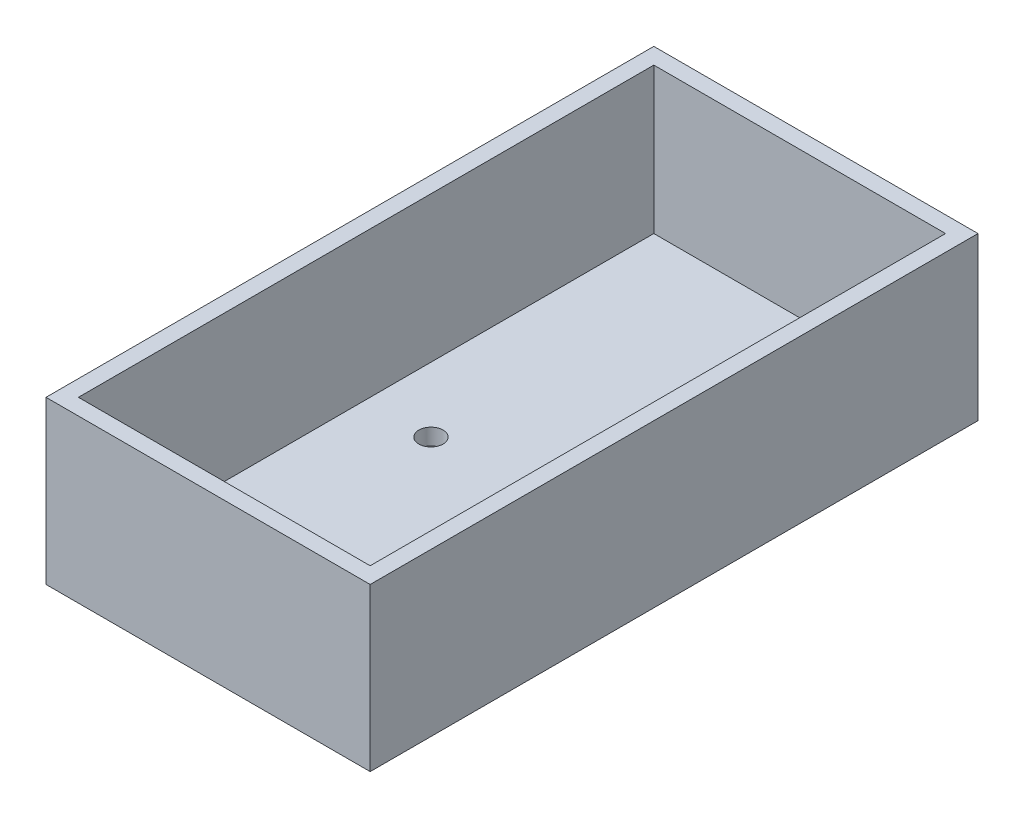
ISO-10303-21;
HEADER;
FILE_DESCRIPTION(('STEP AP214'),'2;1');
FILE_NAME('part.step','',(''),(''),'','','');
FILE_SCHEMA(('AUTOMOTIVE_DESIGN { 1 0 10303 214 1 1 1 1 }'));
ENDSEC;
DATA;
#1=APPLICATION_CONTEXT('core data for automotive mechanical design processes');
#2=APPLICATION_PROTOCOL_DEFINITION('international standard','automotive_design',2000,#1);
#3=PRODUCT_CONTEXT('',#1,'mechanical');
#4=PRODUCT('Part','Part','',(#3));
#5=PRODUCT_RELATED_PRODUCT_CATEGORY('part','',(#4));
#6=PRODUCT_DEFINITION_FORMATION('','',#4);
#7=PRODUCT_DEFINITION_CONTEXT('part definition',#1,'design');
#8=PRODUCT_DEFINITION('design','',#6,#7);
#9=PRODUCT_DEFINITION_SHAPE('','',#8);
#10=(LENGTH_UNIT() NAMED_UNIT(*) SI_UNIT(.MILLI.,.METRE.));
#11=(NAMED_UNIT(*) PLANE_ANGLE_UNIT() SI_UNIT($,.RADIAN.));
#12=(NAMED_UNIT(*) SI_UNIT($,.STERADIAN.) SOLID_ANGLE_UNIT());
#13=UNCERTAINTY_MEASURE_WITH_UNIT(LENGTH_MEASURE(1.E-05),#10,'distance_accuracy_value','');
#14=(GEOMETRIC_REPRESENTATION_CONTEXT(3) GLOBAL_UNCERTAINTY_ASSIGNED_CONTEXT((#13)) GLOBAL_UNIT_ASSIGNED_CONTEXT((#10,
#11,#12)) REPRESENTATION_CONTEXT('',''));
#15=CARTESIAN_POINT('',(0.,0.,0.));
#16=DIRECTION('',(0.,0.,1.));
#17=DIRECTION('',(1.,0.,0.));
#18=AXIS2_PLACEMENT_3D('',#15,#16,#17);
#19=CARTESIAN_POINT('',(20.,20.,37.5));
#20=DIRECTION('',(-1.,0.,0.));
#21=DIRECTION('',(0.,0.,1.));
#22=AXIS2_PLACEMENT_3D('',#19,#20,#21);
#23=PLANE('',#22);
#24=DIRECTION('',(0.,0.,-1.));
#25=VECTOR('',#24,1.);
#26=CARTESIAN_POINT('',(20.,0.,37.5));
#27=LINE('',#26,#25);
#28=CARTESIAN_POINT('',(20.,0.,37.5));
#29=VERTEX_POINT('',#28);
#30=CARTESIAN_POINT('',(20.,0.,-37.5));
#31=VERTEX_POINT('',#30);
#32=EDGE_CURVE('E146',#29,#31,#27,.T.);
#33=ORIENTED_EDGE('',*,*,#32,.T.);
#34=DIRECTION('',(0.,-1.,0.));
#35=VECTOR('',#34,1.);
#36=CARTESIAN_POINT('',(20.,20.,-37.5));
#37=LINE('',#36,#35);
#38=CARTESIAN_POINT('',(20.,20.,-37.5));
#39=VERTEX_POINT('',#38);
#40=EDGE_CURVE('E11',#39,#31,#37,.T.);
#41=ORIENTED_EDGE('',*,*,#40,.F.);
#42=DIRECTION('',(0.,0.,-1.));
#43=VECTOR('',#42,1.);
#44=CARTESIAN_POINT('',(20.,20.,37.5));
#45=LINE('',#44,#43);
#46=CARTESIAN_POINT('',(20.,20.,37.5));
#47=VERTEX_POINT('',#46);
#48=EDGE_CURVE('E150',#47,#39,#45,.T.);
#49=ORIENTED_EDGE('',*,*,#48,.F.);
#50=DIRECTION('',(0.,-1.,0.));
#51=VECTOR('',#50,1.);
#52=CARTESIAN_POINT('',(20.,20.,37.5));
#53=LINE('',#52,#51);
#54=EDGE_CURVE('E156',#47,#29,#53,.T.);
#55=ORIENTED_EDGE('',*,*,#54,.T.);
#56=EDGE_LOOP('',(#33,#41,#49,#55));
#57=FACE_BOUND('',#56,.T.);
#58=ADVANCED_FACE('F33',(#57),#23,.F.);
#59=CARTESIAN_POINT('',(20.,20.,-37.5));
#60=DIRECTION('',(0.,0.,1.));
#61=DIRECTION('',(1.,0.,0.));
#62=AXIS2_PLACEMENT_3D('',#59,#60,#61);
#63=PLANE('',#62);
#64=DIRECTION('',(-1.,0.,0.));
#65=VECTOR('',#64,1.);
#66=CARTESIAN_POINT('',(20.,0.,-37.5));
#67=LINE('',#66,#65);
#68=CARTESIAN_POINT('',(-20.,0.,-37.5));
#69=VERTEX_POINT('',#68);
#70=EDGE_CURVE('E159',#31,#69,#67,.T.);
#71=ORIENTED_EDGE('',*,*,#70,.T.);
#72=DIRECTION('',(0.,-1.,0.));
#73=VECTOR('',#72,1.);
#74=CARTESIAN_POINT('',(-20.,20.,-37.5));
#75=LINE('',#74,#73);
#76=CARTESIAN_POINT('',(-20.,20.,-37.5));
#77=VERTEX_POINT('',#76);
#78=EDGE_CURVE('E41',#77,#69,#75,.T.);
#79=ORIENTED_EDGE('',*,*,#78,.F.);
#80=DIRECTION('',(-1.,0.,0.));
#81=VECTOR('',#80,1.);
#82=CARTESIAN_POINT('',(20.,20.,-37.5));
#83=LINE('',#82,#81);
#84=EDGE_CURVE('E86',#39,#77,#83,.T.);
#85=ORIENTED_EDGE('',*,*,#84,.F.);
#86=ORIENTED_EDGE('',*,*,#40,.T.);
#87=EDGE_LOOP('',(#71,#79,#85,#86));
#88=FACE_BOUND('',#87,.T.);
#89=ADVANCED_FACE('F193',(#88),#63,.F.);
#90=CARTESIAN_POINT('',(-20.,20.,37.5));
#91=DIRECTION('',(1.,0.,0.));
#92=DIRECTION('',(0.,0.,-1.));
#93=AXIS2_PLACEMENT_3D('',#90,#91,#92);
#94=PLANE('',#93);
#95=DIRECTION('',(0.,0.,1.));
#96=VECTOR('',#95,1.);
#97=CARTESIAN_POINT('',(-20.,0.,37.5));
#98=LINE('',#97,#96);
#99=CARTESIAN_POINT('',(-20.,0.,37.5));
#100=VERTEX_POINT('',#99);
#101=EDGE_CURVE('E161',#69,#100,#98,.T.);
#102=ORIENTED_EDGE('',*,*,#101,.T.);
#103=DIRECTION('',(0.,-1.,0.));
#104=VECTOR('',#103,1.);
#105=CARTESIAN_POINT('',(-20.,20.,37.5));
#106=LINE('',#105,#104);
#107=CARTESIAN_POINT('',(-20.,20.,37.5));
#108=VERTEX_POINT('',#107);
#109=EDGE_CURVE('E165',#108,#100,#106,.T.);
#110=ORIENTED_EDGE('',*,*,#109,.F.);
#111=DIRECTION('',(0.,0.,1.));
#112=VECTOR('',#111,1.);
#113=CARTESIAN_POINT('',(-20.,20.,37.5));
#114=LINE('',#113,#112);
#115=EDGE_CURVE('E153',#77,#108,#114,.T.);
#116=ORIENTED_EDGE('',*,*,#115,.F.);
#117=ORIENTED_EDGE('',*,*,#78,.T.);
#118=EDGE_LOOP('',(#102,#110,#116,#117));
#119=FACE_BOUND('',#118,.T.);
#120=ADVANCED_FACE('F198',(#119),#94,.F.);
#121=CARTESIAN_POINT('',(20.,20.,37.5));
#122=DIRECTION('',(0.,0.,-1.));
#123=DIRECTION('',(-1.,0.,0.));
#124=AXIS2_PLACEMENT_3D('',#121,#122,#123);
#125=PLANE('',#124);
#126=DIRECTION('',(1.,0.,0.));
#127=VECTOR('',#126,1.);
#128=CARTESIAN_POINT('',(20.,0.,37.5));
#129=LINE('',#128,#127);
#130=EDGE_CURVE('E79',#100,#29,#129,.T.);
#131=ORIENTED_EDGE('',*,*,#130,.T.);
#132=ORIENTED_EDGE('',*,*,#54,.F.);
#133=DIRECTION('',(1.,0.,0.));
#134=VECTOR('',#133,1.);
#135=CARTESIAN_POINT('',(20.,20.,37.5));
#136=LINE('',#135,#134);
#137=EDGE_CURVE('E58',#108,#47,#136,.T.);
#138=ORIENTED_EDGE('',*,*,#137,.F.);
#139=ORIENTED_EDGE('',*,*,#109,.T.);
#140=EDGE_LOOP('',(#131,#132,#138,#139));
#141=FACE_BOUND('',#140,.T.);
#142=ADVANCED_FACE('F209',(#141),#125,.F.);
#143=CARTESIAN_POINT('',(0.,20.,0.));
#144=DIRECTION('',(0.,1.,0.));
#145=DIRECTION('',(0.,0.,1.));
#146=AXIS2_PLACEMENT_3D('',#143,#144,#145);
#147=PLANE('',#146);
#148=DIRECTION('',(0.,0.,-1.));
#149=VECTOR('',#148,1.);
#150=CARTESIAN_POINT('',(18.,20.,-35.5));
#151=LINE('',#150,#149);
#152=CARTESIAN_POINT('',(18.,20.,35.5));
#153=VERTEX_POINT('',#152);
#154=CARTESIAN_POINT('',(18.,20.,-35.5));
#155=VERTEX_POINT('',#154);
#156=EDGE_CURVE('E49',#153,#155,#151,.T.);
#157=ORIENTED_EDGE('',*,*,#156,.F.);
#158=DIRECTION('',(1.,0.,0.));
#159=VECTOR('',#158,1.);
#160=CARTESIAN_POINT('',(-18.,20.,35.5));
#161=LINE('',#160,#159);
#162=CARTESIAN_POINT('',(-18.,20.,35.5));
#163=VERTEX_POINT('',#162);
#164=EDGE_CURVE('E128',#163,#153,#161,.T.);
#165=ORIENTED_EDGE('',*,*,#164,.F.);
#166=DIRECTION('',(0.,0.,1.));
#167=VECTOR('',#166,1.);
#168=CARTESIAN_POINT('',(-18.,20.,-35.5));
#169=LINE('',#168,#167);
#170=CARTESIAN_POINT('',(-18.,20.,-35.5));
#171=VERTEX_POINT('',#170);
#172=EDGE_CURVE('E131',#171,#163,#169,.T.);
#173=ORIENTED_EDGE('',*,*,#172,.F.);
#174=DIRECTION('',(-1.,0.,0.));
#175=VECTOR('',#174,1.);
#176=CARTESIAN_POINT('',(-18.,20.,-35.5));
#177=LINE('',#176,#175);
#178=EDGE_CURVE('E140',#155,#171,#177,.T.);
#179=ORIENTED_EDGE('',*,*,#178,.F.);
#180=EDGE_LOOP('',(#157,#165,#173,#179));
#181=FACE_BOUND('',#180,.T.);
#182=ORIENTED_EDGE('',*,*,#48,.T.);
#183=ORIENTED_EDGE('',*,*,#84,.T.);
#184=ORIENTED_EDGE('',*,*,#115,.T.);
#185=ORIENTED_EDGE('',*,*,#137,.T.);
#186=EDGE_LOOP('',(#182,#183,#184,#185));
#187=FACE_BOUND('',#186,.T.);
#188=ADVANCED_FACE('F207',(#181,#187),#147,.T.);
#189=CARTESIAN_POINT('',(0.,0.,0.));
#190=DIRECTION('',(0.,1.,0.));
#191=DIRECTION('',(0.,0.,1.));
#192=AXIS2_PLACEMENT_3D('',#189,#190,#191);
#193=PLANE('',#192);
#194=CARTESIAN_POINT('',(-10.,0.,0.));
#195=DIRECTION('',(0.,1.,0.));
#196=DIRECTION('',(0.,0.,1.));
#197=AXIS2_PLACEMENT_3D('',#194,#195,#196);
#198=CIRCLE('',#197,1.5);
#199=CARTESIAN_POINT('',(-10.,0.,1.5));
#200=VERTEX_POINT('',#199);
#201=EDGE_CURVE('E134',#200,#200,#198,.T.);
#202=ORIENTED_EDGE('',*,*,#201,.T.);
#203=EDGE_LOOP('',(#202));
#204=FACE_BOUND('',#203,.T.);
#205=CARTESIAN_POINT('',(10.,0.,0.));
#206=DIRECTION('',(0.,1.,0.));
#207=DIRECTION('',(0.,0.,1.));
#208=AXIS2_PLACEMENT_3D('',#205,#206,#207);
#209=CIRCLE('',#208,1.5);
#210=CARTESIAN_POINT('',(10.,0.,1.5));
#211=VERTEX_POINT('',#210);
#212=EDGE_CURVE('E170',#211,#211,#209,.T.);
#213=ORIENTED_EDGE('',*,*,#212,.T.);
#214=EDGE_LOOP('',(#213));
#215=FACE_BOUND('',#214,.T.);
#216=ORIENTED_EDGE('',*,*,#32,.F.);
#217=ORIENTED_EDGE('',*,*,#130,.F.);
#218=ORIENTED_EDGE('',*,*,#101,.F.);
#219=ORIENTED_EDGE('',*,*,#70,.F.);
#220=EDGE_LOOP('',(#216,#217,#218,#219));
#221=FACE_BOUND('',#220,.T.);
#222=ADVANCED_FACE('F182',(#204,#215,#221),#193,.F.);
#223=CARTESIAN_POINT('',(18.,2.,-35.5));
#224=DIRECTION('',(1.,0.,0.));
#225=DIRECTION('',(0.,0.,-1.));
#226=AXIS2_PLACEMENT_3D('',#223,#224,#225);
#227=PLANE('',#226);
#228=ORIENTED_EDGE('',*,*,#156,.T.);
#229=DIRECTION('',(0.,1.,0.));
#230=VECTOR('',#229,1.);
#231=CARTESIAN_POINT('',(18.,2.,-35.5));
#232=LINE('',#231,#230);
#233=CARTESIAN_POINT('',(18.,2.,-35.5));
#234=VERTEX_POINT('',#233);
#235=EDGE_CURVE('E106',#234,#155,#232,.T.);
#236=ORIENTED_EDGE('',*,*,#235,.F.);
#237=DIRECTION('',(0.,0.,-1.));
#238=VECTOR('',#237,1.);
#239=CARTESIAN_POINT('',(18.,2.,-35.5));
#240=LINE('',#239,#238);
#241=CARTESIAN_POINT('',(18.,2.,35.5));
#242=VERTEX_POINT('',#241);
#243=EDGE_CURVE('E110',#242,#234,#240,.T.);
#244=ORIENTED_EDGE('',*,*,#243,.F.);
#245=DIRECTION('',(0.,1.,0.));
#246=VECTOR('',#245,1.);
#247=CARTESIAN_POINT('',(18.,2.,35.5));
#248=LINE('',#247,#246);
#249=EDGE_CURVE('E144',#242,#153,#248,.T.);
#250=ORIENTED_EDGE('',*,*,#249,.T.);
#251=EDGE_LOOP('',(#228,#236,#244,#250));
#252=FACE_BOUND('',#251,.T.);
#253=ADVANCED_FACE('F108',(#252),#227,.F.);
#254=CARTESIAN_POINT('',(-18.,2.,35.5));
#255=DIRECTION('',(0.,0.,1.));
#256=DIRECTION('',(1.,0.,0.));
#257=AXIS2_PLACEMENT_3D('',#254,#255,#256);
#258=PLANE('',#257);
#259=ORIENTED_EDGE('',*,*,#164,.T.);
#260=ORIENTED_EDGE('',*,*,#249,.F.);
#261=DIRECTION('',(1.,0.,0.));
#262=VECTOR('',#261,1.);
#263=CARTESIAN_POINT('',(-18.,2.,35.5));
#264=LINE('',#263,#262);
#265=CARTESIAN_POINT('',(-18.,2.,35.5));
#266=VERTEX_POINT('',#265);
#267=EDGE_CURVE('E116',#266,#242,#264,.T.);
#268=ORIENTED_EDGE('',*,*,#267,.F.);
#269=DIRECTION('',(0.,1.,0.));
#270=VECTOR('',#269,1.);
#271=CARTESIAN_POINT('',(-18.,2.,35.5));
#272=LINE('',#271,#270);
#273=EDGE_CURVE('E147',#266,#163,#272,.T.);
#274=ORIENTED_EDGE('',*,*,#273,.T.);
#275=EDGE_LOOP('',(#259,#260,#268,#274));
#276=FACE_BOUND('',#275,.T.);
#277=ADVANCED_FACE('F244',(#276),#258,.F.);
#278=CARTESIAN_POINT('',(-18.,2.,-35.5));
#279=DIRECTION('',(-1.,0.,0.));
#280=DIRECTION('',(0.,0.,1.));
#281=AXIS2_PLACEMENT_3D('',#278,#279,#280);
#282=PLANE('',#281);
#283=ORIENTED_EDGE('',*,*,#172,.T.);
#284=ORIENTED_EDGE('',*,*,#273,.F.);
#285=DIRECTION('',(0.,0.,1.));
#286=VECTOR('',#285,1.);
#287=CARTESIAN_POINT('',(-18.,2.,-35.5));
#288=LINE('',#287,#286);
#289=CARTESIAN_POINT('',(-18.,2.,-35.5));
#290=VERTEX_POINT('',#289);
#291=EDGE_CURVE('E124',#290,#266,#288,.T.);
#292=ORIENTED_EDGE('',*,*,#291,.F.);
#293=DIRECTION('',(0.,1.,0.));
#294=VECTOR('',#293,1.);
#295=CARTESIAN_POINT('',(-18.,2.,-35.5));
#296=LINE('',#295,#294);
#297=EDGE_CURVE('E115',#290,#171,#296,.T.);
#298=ORIENTED_EDGE('',*,*,#297,.T.);
#299=EDGE_LOOP('',(#283,#284,#292,#298));
#300=FACE_BOUND('',#299,.T.);
#301=ADVANCED_FACE('F252',(#300),#282,.F.);
#302=CARTESIAN_POINT('',(-18.,2.,-35.5));
#303=DIRECTION('',(0.,0.,-1.));
#304=DIRECTION('',(-1.,0.,0.));
#305=AXIS2_PLACEMENT_3D('',#302,#303,#304);
#306=PLANE('',#305);
#307=ORIENTED_EDGE('',*,*,#178,.T.);
#308=ORIENTED_EDGE('',*,*,#297,.F.);
#309=DIRECTION('',(-1.,0.,0.));
#310=VECTOR('',#309,1.);
#311=CARTESIAN_POINT('',(-18.,2.,-35.5));
#312=LINE('',#311,#310);
#313=EDGE_CURVE('E119',#234,#290,#312,.T.);
#314=ORIENTED_EDGE('',*,*,#313,.F.);
#315=ORIENTED_EDGE('',*,*,#235,.T.);
#316=EDGE_LOOP('',(#307,#308,#314,#315));
#317=FACE_BOUND('',#316,.T.);
#318=ADVANCED_FACE('F120',(#317),#306,.F.);
#319=CARTESIAN_POINT('',(0.,2.,0.));
#320=DIRECTION('',(0.,1.,0.));
#321=DIRECTION('',(0.,0.,1.));
#322=AXIS2_PLACEMENT_3D('',#319,#320,#321);
#323=PLANE('',#322);
#324=CARTESIAN_POINT('',(-10.,2.,0.));
#325=DIRECTION('',(0.,1.,0.));
#326=DIRECTION('',(0.,0.,1.));
#327=AXIS2_PLACEMENT_3D('',#324,#325,#326);
#328=CIRCLE('',#327,1.5);
#329=CARTESIAN_POINT('',(-10.,2.,1.5));
#330=VERTEX_POINT('',#329);
#331=EDGE_CURVE('E36',#330,#330,#328,.T.);
#332=ORIENTED_EDGE('',*,*,#331,.F.);
#333=EDGE_LOOP('',(#332));
#334=FACE_BOUND('',#333,.T.);
#335=CARTESIAN_POINT('',(10.,2.,0.));
#336=DIRECTION('',(0.,1.,0.));
#337=DIRECTION('',(0.,0.,1.));
#338=AXIS2_PLACEMENT_3D('',#335,#336,#337);
#339=CIRCLE('',#338,1.5);
#340=CARTESIAN_POINT('',(10.,2.,1.5));
#341=VERTEX_POINT('',#340);
#342=EDGE_CURVE('E168',#341,#341,#339,.T.);
#343=ORIENTED_EDGE('',*,*,#342,.F.);
#344=EDGE_LOOP('',(#343));
#345=FACE_BOUND('',#344,.T.);
#346=ORIENTED_EDGE('',*,*,#243,.T.);
#347=ORIENTED_EDGE('',*,*,#313,.T.);
#348=ORIENTED_EDGE('',*,*,#291,.T.);
#349=ORIENTED_EDGE('',*,*,#267,.T.);
#350=EDGE_LOOP('',(#346,#347,#348,#349));
#351=FACE_BOUND('',#350,.T.);
#352=ADVANCED_FACE('F126',(#334,#345,#351),#323,.T.);
#353=CARTESIAN_POINT('',(10.,-1.2E-05,0.));
#354=DIRECTION('',(0.,1.,0.));
#355=DIRECTION('',(0.,0.,1.));
#356=AXIS2_PLACEMENT_3D('',#353,#354,#355);
#357=CYLINDRICAL_SURFACE('',#356,1.5);
#358=CARTESIAN_POINT('',(10.,2.,1.5));
#359=CARTESIAN_POINT('',(10.,1.97916666666667,1.5));
#360=CARTESIAN_POINT('',(10.,1.95833333333334,1.5));
#361=CARTESIAN_POINT('',(10.,1.91666666666667,1.5));
#362=CARTESIAN_POINT('',(10.,1.89583333333334,1.5));
#363=CARTESIAN_POINT('',(10.,1.85416666666667,1.5));
#364=CARTESIAN_POINT('',(10.,1.83333333333334,1.5));
#365=CARTESIAN_POINT('',(10.,1.79166666666667,1.5));
#366=CARTESIAN_POINT('',(10.,1.77083333333334,1.5));
#367=CARTESIAN_POINT('',(10.,1.72916666666667,1.5));
#368=CARTESIAN_POINT('',(10.,1.70833333333334,1.5));
#369=CARTESIAN_POINT('',(10.,1.66666666666667,1.5));
#370=CARTESIAN_POINT('',(10.,1.64583333333334,1.5));
#371=CARTESIAN_POINT('',(10.,1.60416666666667,1.5));
#372=CARTESIAN_POINT('',(10.,1.58333333333334,1.5));
#373=CARTESIAN_POINT('',(10.,1.54166666666667,1.5));
#374=CARTESIAN_POINT('',(10.,1.52083333333334,1.5));
#375=CARTESIAN_POINT('',(10.,1.47916666666667,1.5));
#376=CARTESIAN_POINT('',(10.,1.45833333333334,1.5));
#377=CARTESIAN_POINT('',(10.,1.41666666666667,1.5));
#378=CARTESIAN_POINT('',(10.,1.39583333333334,1.5));
#379=CARTESIAN_POINT('',(10.,1.35416666666667,1.5));
#380=CARTESIAN_POINT('',(10.,1.33333333333334,1.5));
#381=CARTESIAN_POINT('',(10.,1.29166666666667,1.5));
#382=CARTESIAN_POINT('',(10.,1.27083333333333,1.5));
#383=CARTESIAN_POINT('',(10.,1.22916666666667,1.5));
#384=CARTESIAN_POINT('',(10.,1.20833333333333,1.5));
#385=CARTESIAN_POINT('',(10.,1.16666666666667,1.5));
#386=CARTESIAN_POINT('',(10.,1.14583333333333,1.5));
#387=CARTESIAN_POINT('',(10.,1.10416666666667,1.5));
#388=CARTESIAN_POINT('',(10.,1.08333333333333,1.5));
#389=CARTESIAN_POINT('',(10.,1.04166666666667,1.5));
#390=CARTESIAN_POINT('',(10.,1.02083333333333,1.5));
#391=CARTESIAN_POINT('',(10.,0.979166666666668,1.5));
#392=CARTESIAN_POINT('',(10.,0.958333333333334,1.5));
#393=CARTESIAN_POINT('',(10.,0.916666666666668,1.5));
#394=CARTESIAN_POINT('',(10.,0.895833333333334,1.5));
#395=CARTESIAN_POINT('',(10.,0.854166666666668,1.5));
#396=CARTESIAN_POINT('',(10.,0.833333333333334,1.5));
#397=CARTESIAN_POINT('',(10.,0.791666666666668,1.5));
#398=CARTESIAN_POINT('',(10.,0.770833333333334,1.5));
#399=CARTESIAN_POINT('',(10.,0.729166666666668,1.5));
#400=CARTESIAN_POINT('',(10.,0.708333333333334,1.5));
#401=CARTESIAN_POINT('',(10.,0.666666666666668,1.5));
#402=CARTESIAN_POINT('',(10.,0.645833333333334,1.5));
#403=CARTESIAN_POINT('',(10.,0.604166666666668,1.5));
#404=CARTESIAN_POINT('',(10.,0.583333333333334,1.5));
#405=CARTESIAN_POINT('',(10.,0.541666666666667,1.5));
#406=CARTESIAN_POINT('',(10.,0.520833333333334,1.5));
#407=CARTESIAN_POINT('',(10.,0.479166666666667,1.5));
#408=CARTESIAN_POINT('',(10.,0.458333333333334,1.5));
#409=CARTESIAN_POINT('',(10.,0.416666666666667,1.5));
#410=CARTESIAN_POINT('',(10.,0.395833333333334,1.5));
#411=CARTESIAN_POINT('',(10.,0.354166666666667,1.5));
#412=CARTESIAN_POINT('',(10.,0.333333333333334,1.5));
#413=CARTESIAN_POINT('',(10.,0.291666666666667,1.5));
#414=CARTESIAN_POINT('',(10.,0.270833333333334,1.5));
#415=CARTESIAN_POINT('',(10.,0.229166666666667,1.5));
#416=CARTESIAN_POINT('',(10.,0.208333333333334,1.5));
#417=CARTESIAN_POINT('',(10.,0.166666666666667,1.5));
#418=CARTESIAN_POINT('',(10.,0.145833333333334,1.5));
#419=CARTESIAN_POINT('',(10.,0.104166666666667,1.5));
#420=CARTESIAN_POINT('',(10.,0.0833333333333336,1.5));
#421=CARTESIAN_POINT('',(10.,0.0416666666666669,1.5));
#422=CARTESIAN_POINT('',(10.,0.0208333333333335,1.5));
#423=CARTESIAN_POINT('',(10.,0.,1.5));
#424=B_SPLINE_CURVE_WITH_KNOTS('',3,(#358,#359,#360,#361,#362,#363,#364,#365,#366,#367,#368,
#369,#370,#371,#372,#373,#374,#375,#376,#377,#378,#379,#380,#381,#382,#383,#384,#385,#386,#387,
#388,#389,#390,#391,#392,#393,#394,#395,#396,#397,#398,#399,#400,#401,#402,#403,#404,#405,#406,
#407,#408,#409,#410,#411,#412,#413,#414,#415,#416,#417,#418,#419,#420,#421,#422,#423),
.UNSPECIFIED.,.F.,.F.,(4,2,2,2,2,2,2,2,2,2,2,2,2,2,2,2,2,2,2,2,2,2,2,2,2,2,2,2,2,2,2,2,4),(0.,
0.0624999999999996,0.125,0.1875,0.25,0.3125,0.375,0.4375,0.5,0.5625,0.625,0.6875,0.75,
0.812500000000001,0.875000000000001,0.937500000000001,1.,1.0625,1.125,1.1875,1.25,1.3125,1.375,
1.4375,1.5,1.5625,1.625,1.6875,1.75,1.8125,1.875,1.9375,2.),.UNSPECIFIED.);
#425=EDGE_CURVE('BSEAM186',#341,#211,#424,.T.);
#426=ORIENTED_EDGE('',*,*,#342,.T.);
#427=ORIENTED_EDGE('',*,*,#212,.F.);
#428=ORIENTED_EDGE('',*,*,#425,.T.);
#429=ORIENTED_EDGE('',*,*,#425,.F.);
#430=EDGE_LOOP('',(#426,#428,#427,#429));
#431=FACE_BOUND('',#430,.T.);
#432=ADVANCED_FACE('F186',(#431),#357,.F.);
#433=CARTESIAN_POINT('',(-10.,-1.2E-05,0.));
#434=DIRECTION('',(0.,1.,0.));
#435=DIRECTION('',(0.,0.,1.));
#436=AXIS2_PLACEMENT_3D('',#433,#434,#435);
#437=CYLINDRICAL_SURFACE('',#436,1.5);
#438=CARTESIAN_POINT('',(-10.,2.,1.5));
#439=CARTESIAN_POINT('',(-10.,1.97916666666667,1.5));
#440=CARTESIAN_POINT('',(-10.,1.95833333333334,1.5));
#441=CARTESIAN_POINT('',(-10.,1.91666666666667,1.5));
#442=CARTESIAN_POINT('',(-10.,1.89583333333334,1.5));
#443=CARTESIAN_POINT('',(-10.,1.85416666666667,1.5));
#444=CARTESIAN_POINT('',(-10.,1.83333333333334,1.5));
#445=CARTESIAN_POINT('',(-10.,1.79166666666667,1.5));
#446=CARTESIAN_POINT('',(-10.,1.77083333333334,1.5));
#447=CARTESIAN_POINT('',(-10.,1.72916666666667,1.5));
#448=CARTESIAN_POINT('',(-10.,1.70833333333334,1.5));
#449=CARTESIAN_POINT('',(-10.,1.66666666666667,1.5));
#450=CARTESIAN_POINT('',(-10.,1.64583333333334,1.5));
#451=CARTESIAN_POINT('',(-10.,1.60416666666667,1.5));
#452=CARTESIAN_POINT('',(-10.,1.58333333333334,1.5));
#453=CARTESIAN_POINT('',(-10.,1.54166666666667,1.5));
#454=CARTESIAN_POINT('',(-10.,1.52083333333334,1.5));
#455=CARTESIAN_POINT('',(-10.,1.47916666666667,1.5));
#456=CARTESIAN_POINT('',(-10.,1.45833333333334,1.5));
#457=CARTESIAN_POINT('',(-10.,1.41666666666667,1.5));
#458=CARTESIAN_POINT('',(-10.,1.39583333333334,1.5));
#459=CARTESIAN_POINT('',(-10.,1.35416666666667,1.5));
#460=CARTESIAN_POINT('',(-10.,1.33333333333334,1.5));
#461=CARTESIAN_POINT('',(-10.,1.29166666666667,1.5));
#462=CARTESIAN_POINT('',(-10.,1.27083333333333,1.5));
#463=CARTESIAN_POINT('',(-10.,1.22916666666667,1.5));
#464=CARTESIAN_POINT('',(-10.,1.20833333333333,1.5));
#465=CARTESIAN_POINT('',(-10.,1.16666666666667,1.5));
#466=CARTESIAN_POINT('',(-10.,1.14583333333333,1.5));
#467=CARTESIAN_POINT('',(-10.,1.10416666666667,1.5));
#468=CARTESIAN_POINT('',(-10.,1.08333333333333,1.5));
#469=CARTESIAN_POINT('',(-10.,1.04166666666667,1.5));
#470=CARTESIAN_POINT('',(-10.,1.02083333333333,1.5));
#471=CARTESIAN_POINT('',(-10.,0.979166666666668,1.5));
#472=CARTESIAN_POINT('',(-10.,0.958333333333334,1.5));
#473=CARTESIAN_POINT('',(-10.,0.916666666666668,1.5));
#474=CARTESIAN_POINT('',(-10.,0.895833333333334,1.5));
#475=CARTESIAN_POINT('',(-10.,0.854166666666668,1.5));
#476=CARTESIAN_POINT('',(-10.,0.833333333333334,1.5));
#477=CARTESIAN_POINT('',(-10.,0.791666666666668,1.5));
#478=CARTESIAN_POINT('',(-10.,0.770833333333334,1.5));
#479=CARTESIAN_POINT('',(-10.,0.729166666666668,1.5));
#480=CARTESIAN_POINT('',(-10.,0.708333333333334,1.5));
#481=CARTESIAN_POINT('',(-10.,0.666666666666668,1.5));
#482=CARTESIAN_POINT('',(-10.,0.645833333333334,1.5));
#483=CARTESIAN_POINT('',(-10.,0.604166666666668,1.5));
#484=CARTESIAN_POINT('',(-10.,0.583333333333334,1.5));
#485=CARTESIAN_POINT('',(-10.,0.541666666666667,1.5));
#486=CARTESIAN_POINT('',(-10.,0.520833333333334,1.5));
#487=CARTESIAN_POINT('',(-10.,0.479166666666667,1.5));
#488=CARTESIAN_POINT('',(-10.,0.458333333333334,1.5));
#489=CARTESIAN_POINT('',(-10.,0.416666666666667,1.5));
#490=CARTESIAN_POINT('',(-10.,0.395833333333334,1.5));
#491=CARTESIAN_POINT('',(-10.,0.354166666666667,1.5));
#492=CARTESIAN_POINT('',(-10.,0.333333333333334,1.5));
#493=CARTESIAN_POINT('',(-10.,0.291666666666667,1.5));
#494=CARTESIAN_POINT('',(-10.,0.270833333333334,1.5));
#495=CARTESIAN_POINT('',(-10.,0.229166666666667,1.5));
#496=CARTESIAN_POINT('',(-10.,0.208333333333334,1.5));
#497=CARTESIAN_POINT('',(-10.,0.166666666666667,1.5));
#498=CARTESIAN_POINT('',(-10.,0.145833333333334,1.5));
#499=CARTESIAN_POINT('',(-10.,0.104166666666667,1.5));
#500=CARTESIAN_POINT('',(-10.,0.0833333333333336,1.5));
#501=CARTESIAN_POINT('',(-10.,0.0416666666666669,1.5));
#502=CARTESIAN_POINT('',(-10.,0.0208333333333335,1.5));
#503=CARTESIAN_POINT('',(-10.,0.,1.5));
#504=B_SPLINE_CURVE_WITH_KNOTS('',3,(#438,#439,#440,#441,#442,#443,#444,#445,#446,#447,#448,
#449,#450,#451,#452,#453,#454,#455,#456,#457,#458,#459,#460,#461,#462,#463,#464,#465,#466,#467,
#468,#469,#470,#471,#472,#473,#474,#475,#476,#477,#478,#479,#480,#481,#482,#483,#484,#485,#486,
#487,#488,#489,#490,#491,#492,#493,#494,#495,#496,#497,#498,#499,#500,#501,#502,#503),
.UNSPECIFIED.,.F.,.F.,(4,2,2,2,2,2,2,2,2,2,2,2,2,2,2,2,2,2,2,2,2,2,2,2,2,2,2,2,2,2,2,2,4),(0.,
0.0624999999999996,0.125,0.1875,0.25,0.3125,0.375,0.4375,0.5,0.5625,0.625,0.6875,0.75,
0.812500000000001,0.875000000000001,0.937500000000001,1.,1.0625,1.125,1.1875,1.25,1.3125,1.375,
1.4375,1.5,1.5625,1.625,1.6875,1.75,1.8125,1.875,1.9375,2.),.UNSPECIFIED.);
#505=EDGE_CURVE('BSEAM184',#330,#200,#504,.T.);
#506=ORIENTED_EDGE('',*,*,#331,.T.);
#507=ORIENTED_EDGE('',*,*,#201,.F.);
#508=ORIENTED_EDGE('',*,*,#505,.T.);
#509=ORIENTED_EDGE('',*,*,#505,.F.);
#510=EDGE_LOOP('',(#506,#508,#507,#509));
#511=FACE_BOUND('',#510,.T.);
#512=ADVANCED_FACE('F184',(#511),#437,.F.);
#513=CLOSED_SHELL('',(#58,#89,#120,#142,#188,#222,#253,#277,#301,#318,#352,#432,#512));
#514=MANIFOLD_SOLID_BREP('B2',#513);
#515=ADVANCED_BREP_SHAPE_REPRESENTATION('',(#18,#514),#14);
#516=SHAPE_DEFINITION_REPRESENTATION(#9,#515);
ENDSEC;
END-ISO-10303-21;
